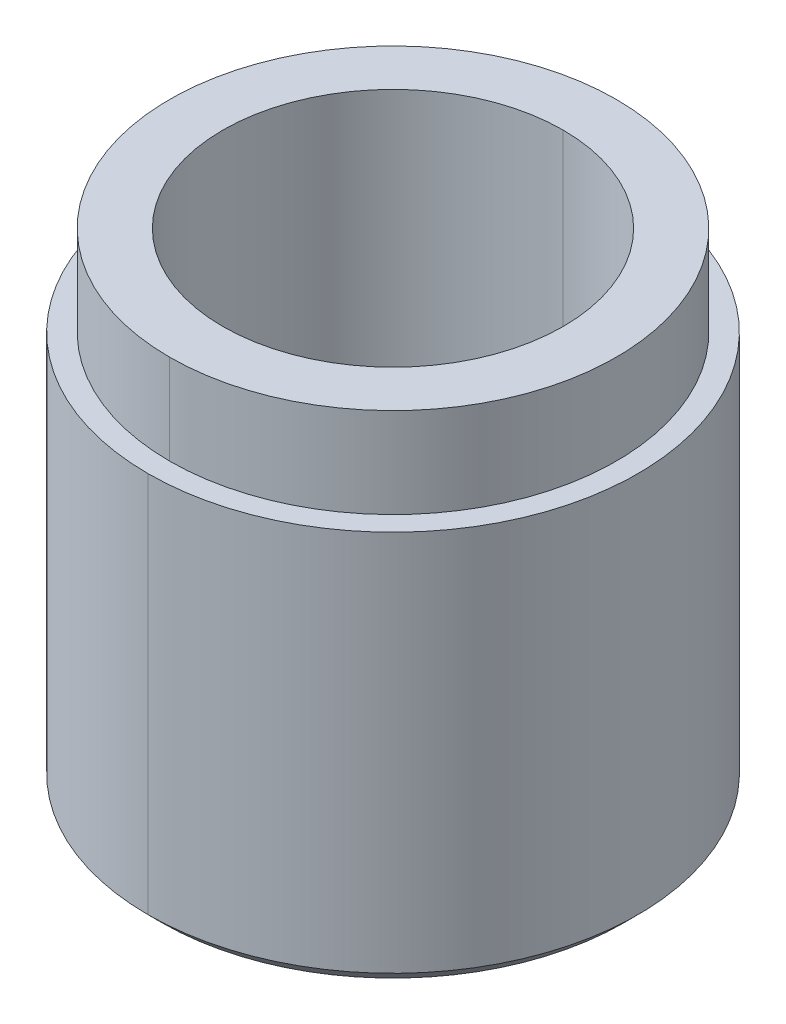
ISO-10303-21;
HEADER;
FILE_DESCRIPTION(('STEP AP214'),'2;1');
FILE_NAME('part.step','',(''),(''),'','','');
FILE_SCHEMA(('AUTOMOTIVE_DESIGN { 1 0 10303 214 1 1 1 1 }'));
ENDSEC;
DATA;
#1=APPLICATION_CONTEXT('core data for automotive mechanical design processes');
#2=APPLICATION_PROTOCOL_DEFINITION('international standard','automotive_design',2000,#1);
#3=PRODUCT_CONTEXT('',#1,'mechanical');
#4=PRODUCT('Part','Part','',(#3));
#5=PRODUCT_RELATED_PRODUCT_CATEGORY('part','',(#4));
#6=PRODUCT_DEFINITION_FORMATION('','',#4);
#7=PRODUCT_DEFINITION_CONTEXT('part definition',#1,'design');
#8=PRODUCT_DEFINITION('design','',#6,#7);
#9=PRODUCT_DEFINITION_SHAPE('','',#8);
#10=(LENGTH_UNIT() NAMED_UNIT(*) SI_UNIT(.MILLI.,.METRE.));
#11=(NAMED_UNIT(*) PLANE_ANGLE_UNIT() SI_UNIT($,.RADIAN.));
#12=(NAMED_UNIT(*) SI_UNIT($,.STERADIAN.) SOLID_ANGLE_UNIT());
#13=UNCERTAINTY_MEASURE_WITH_UNIT(LENGTH_MEASURE(1.E-05),#10,'distance_accuracy_value','');
#14=(GEOMETRIC_REPRESENTATION_CONTEXT(3) GLOBAL_UNCERTAINTY_ASSIGNED_CONTEXT((#13)) GLOBAL_UNIT_ASSIGNED_CONTEXT((#10,
#11,#12)) REPRESENTATION_CONTEXT('',''));
#15=CARTESIAN_POINT('',(0.,0.,0.));
#16=DIRECTION('',(0.,0.,1.));
#17=DIRECTION('',(1.,0.,0.));
#18=AXIS2_PLACEMENT_3D('',#15,#16,#17);
#19=CARTESIAN_POINT('',(0.,-8.0725,0.));
#20=DIRECTION('',(0.,1.,0.));
#21=DIRECTION('',(0.,0.,1.));
#22=AXIS2_PLACEMENT_3D('',#19,#20,#21);
#23=CONICAL_SURFACE('',#22,8.636,0.785398163397448);
#24=DIRECTION('',(0.,0.707106781186548,-0.707106781186548));
#25=VECTOR('',#24,1.);
#26=CARTESIAN_POINT('',(0.,-8.0725,-8.636));
#27=LINE('',#26,#25);
#28=CARTESIAN_POINT('',(0.,-8.5725,-8.136));
#29=VERTEX_POINT('',#28);
#30=CARTESIAN_POINT('',(0.,-8.0725,-8.636));
#31=VERTEX_POINT('',#30);
#32=EDGE_CURVE('E110',#29,#31,#27,.T.);
#33=ORIENTED_EDGE('',*,*,#32,.F.);
#34=CARTESIAN_POINT('',(0.,-8.5725,0.));
#35=DIRECTION('',(0.,-1.,0.));
#36=DIRECTION('',(0.,0.,1.));
#37=AXIS2_PLACEMENT_3D('',#34,#35,#36);
#38=CIRCLE('',#37,8.136);
#39=CARTESIAN_POINT('',(0.,-8.5725,8.136));
#40=VERTEX_POINT('',#39);
#41=EDGE_CURVE('E11',#40,#29,#38,.T.);
#42=ORIENTED_EDGE('',*,*,#41,.F.);
#43=DIRECTION('',(0.,0.707106781186548,0.707106781186548));
#44=VECTOR('',#43,1.);
#45=CARTESIAN_POINT('',(0.,-8.0725,8.636));
#46=LINE('',#45,#44);
#47=CARTESIAN_POINT('',(0.,-8.0725,8.636));
#48=VERTEX_POINT('',#47);
#49=EDGE_CURVE('E118',#40,#48,#46,.T.);
#50=ORIENTED_EDGE('',*,*,#49,.T.);
#51=CARTESIAN_POINT('',(0.,-8.0725,0.));
#52=DIRECTION('',(0.,1.,0.));
#53=DIRECTION('',(0.,0.,1.));
#54=AXIS2_PLACEMENT_3D('',#51,#52,#53);
#55=CIRCLE('',#54,8.636);
#56=EDGE_CURVE('E27',#31,#48,#55,.T.);
#57=ORIENTED_EDGE('',*,*,#56,.F.);
#58=EDGE_LOOP('',(#33,#42,#50,#57));
#59=FACE_BOUND('',#58,.T.);
#60=ADVANCED_FACE('F16',(#59),#23,.T.);
#61=CARTESIAN_POINT('',(0.,-8.5725,-8.636));
#62=DIRECTION('',(0.,1.,0.));
#63=DIRECTION('',(1.,0.,0.));
#64=AXIS2_PLACEMENT_3D('',#61,#62,#63);
#65=PLANE('',#64);
#66=CARTESIAN_POINT('',(0.,-8.5725,0.));
#67=DIRECTION('',(0.,1.,0.));
#68=DIRECTION('',(0.,0.,1.));
#69=AXIS2_PLACEMENT_3D('',#66,#67,#68);
#70=CIRCLE('',#69,6.);
#71=CARTESIAN_POINT('',(0.,-8.5725,6.));
#72=VERTEX_POINT('',#71);
#73=CARTESIAN_POINT('',(0.,-8.5725,-6.));
#74=VERTEX_POINT('',#73);
#75=EDGE_CURVE('E153',#72,#74,#70,.T.);
#76=ORIENTED_EDGE('',*,*,#75,.T.);
#77=CARTESIAN_POINT('',(0.,-8.5725,0.));
#78=DIRECTION('',(0.,1.,0.));
#79=DIRECTION('',(0.,0.,1.));
#80=AXIS2_PLACEMENT_3D('',#77,#78,#79);
#81=CIRCLE('',#80,6.);
#82=EDGE_CURVE('E159',#74,#72,#81,.T.);
#83=ORIENTED_EDGE('',*,*,#82,.T.);
#84=EDGE_LOOP('',(#76,#83));
#85=FACE_BOUND('',#84,.T.);
#86=ORIENTED_EDGE('',*,*,#41,.T.);
#87=CARTESIAN_POINT('',(0.,-8.5725,0.));
#88=DIRECTION('',(0.,-1.,0.));
#89=DIRECTION('',(0.,0.,1.));
#90=AXIS2_PLACEMENT_3D('',#87,#88,#89);
#91=CIRCLE('',#90,8.136);
#92=EDGE_CURVE('E105',#29,#40,#91,.T.);
#93=ORIENTED_EDGE('',*,*,#92,.T.);
#94=EDGE_LOOP('',(#86,#93));
#95=FACE_BOUND('',#94,.T.);
#96=ADVANCED_FACE('F103',(#85,#95),#65,.F.);
#97=CARTESIAN_POINT('',(0.,8.5725,0.));
#98=DIRECTION('',(0.,1.,0.));
#99=DIRECTION('',(0.,0.,1.));
#100=AXIS2_PLACEMENT_3D('',#97,#98,#99);
#101=CYLINDRICAL_SURFACE('',#100,8.636);
#102=DIRECTION('',(0.,1.,0.));
#103=VECTOR('',#102,1.);
#104=CARTESIAN_POINT('',(0.,8.5725,-8.636));
#105=LINE('',#104,#103);
#106=CARTESIAN_POINT('',(0.,5.3975,-8.636));
#107=VERTEX_POINT('',#106);
#108=EDGE_CURVE('E141',#31,#107,#105,.T.);
#109=ORIENTED_EDGE('',*,*,#108,.F.);
#110=ORIENTED_EDGE('',*,*,#56,.T.);
#111=DIRECTION('',(0.,1.,0.));
#112=VECTOR('',#111,1.);
#113=CARTESIAN_POINT('',(0.,8.5725,8.636));
#114=LINE('',#113,#112);
#115=CARTESIAN_POINT('',(0.,5.3975,8.636));
#116=VERTEX_POINT('',#115);
#117=EDGE_CURVE('E128',#48,#116,#114,.T.);
#118=ORIENTED_EDGE('',*,*,#117,.T.);
#119=CARTESIAN_POINT('',(0.,5.3975,0.));
#120=DIRECTION('',(0.,1.,0.));
#121=DIRECTION('',(0.,0.,1.));
#122=AXIS2_PLACEMENT_3D('',#119,#120,#121);
#123=CIRCLE('',#122,8.636);
#124=EDGE_CURVE('E137',#107,#116,#123,.T.);
#125=ORIENTED_EDGE('',*,*,#124,.F.);
#126=EDGE_LOOP('',(#109,#110,#118,#125));
#127=FACE_BOUND('',#126,.T.);
#128=ADVANCED_FACE('F180',(#127),#101,.T.);
#129=CARTESIAN_POINT('',(0.,5.3975,-7.874));
#130=DIRECTION('',(0.,-1.,0.));
#131=DIRECTION('',(0.,0.,-1.));
#132=AXIS2_PLACEMENT_3D('',#129,#130,#131);
#133=PLANE('',#132);
#134=CARTESIAN_POINT('',(0.,5.3975,0.));
#135=DIRECTION('',(0.,1.,0.));
#136=DIRECTION('',(0.,0.,1.));
#137=AXIS2_PLACEMENT_3D('',#134,#135,#136);
#138=CIRCLE('',#137,7.874);
#139=CARTESIAN_POINT('',(0.,5.3975,7.874));
#140=VERTEX_POINT('',#139);
#141=CARTESIAN_POINT('',(0.,5.3975,-7.874));
#142=VERTEX_POINT('',#141);
#143=EDGE_CURVE('E132',#140,#142,#138,.T.);
#144=ORIENTED_EDGE('',*,*,#143,.F.);
#145=CARTESIAN_POINT('',(0.,5.3975,0.));
#146=DIRECTION('',(0.,1.,0.));
#147=DIRECTION('',(0.,0.,1.));
#148=AXIS2_PLACEMENT_3D('',#145,#146,#147);
#149=CIRCLE('',#148,7.874);
#150=EDGE_CURVE('E135',#142,#140,#149,.T.);
#151=ORIENTED_EDGE('',*,*,#150,.F.);
#152=EDGE_LOOP('',(#144,#151));
#153=FACE_BOUND('',#152,.T.);
#154=CARTESIAN_POINT('',(0.,5.3975,0.));
#155=DIRECTION('',(0.,1.,0.));
#156=DIRECTION('',(0.,0.,1.));
#157=AXIS2_PLACEMENT_3D('',#154,#155,#156);
#158=CIRCLE('',#157,8.636);
#159=EDGE_CURVE('E20',#116,#107,#158,.T.);
#160=ORIENTED_EDGE('',*,*,#159,.T.);
#161=ORIENTED_EDGE('',*,*,#124,.T.);
#162=EDGE_LOOP('',(#160,#161));
#163=FACE_BOUND('',#162,.T.);
#164=ADVANCED_FACE('F18',(#153,#163),#133,.F.);
#165=CARTESIAN_POINT('',(0.,8.5725,0.));
#166=DIRECTION('',(0.,1.,0.));
#167=DIRECTION('',(0.,0.,1.));
#168=AXIS2_PLACEMENT_3D('',#165,#166,#167);
#169=CYLINDRICAL_SURFACE('',#168,7.874);
#170=DIRECTION('',(0.,1.,0.));
#171=VECTOR('',#170,1.);
#172=CARTESIAN_POINT('',(0.,8.5725,-7.874));
#173=LINE('',#172,#171);
#174=CARTESIAN_POINT('',(0.,8.5725,-7.874));
#175=VERTEX_POINT('',#174);
#176=EDGE_CURVE('E154',#142,#175,#173,.T.);
#177=ORIENTED_EDGE('',*,*,#176,.F.);
#178=ORIENTED_EDGE('',*,*,#150,.T.);
#179=DIRECTION('',(0.,1.,0.));
#180=VECTOR('',#179,1.);
#181=CARTESIAN_POINT('',(0.,8.5725,7.874));
#182=LINE('',#181,#180);
#183=CARTESIAN_POINT('',(0.,8.5725,7.874));
#184=VERTEX_POINT('',#183);
#185=EDGE_CURVE('E125',#140,#184,#182,.T.);
#186=ORIENTED_EDGE('',*,*,#185,.T.);
#187=CARTESIAN_POINT('',(0.,8.5725,0.));
#188=DIRECTION('',(0.,1.,0.));
#189=DIRECTION('',(0.,0.,1.));
#190=AXIS2_PLACEMENT_3D('',#187,#188,#189);
#191=CIRCLE('',#190,7.874);
#192=EDGE_CURVE('E64',#175,#184,#191,.T.);
#193=ORIENTED_EDGE('',*,*,#192,.F.);
#194=EDGE_LOOP('',(#177,#178,#186,#193));
#195=FACE_BOUND('',#194,.T.);
#196=ADVANCED_FACE('F316',(#195),#169,.T.);
#197=CARTESIAN_POINT('',(0.,8.5725,-6.));
#198=DIRECTION('',(0.,-1.,0.));
#199=DIRECTION('',(0.,0.,-1.));
#200=AXIS2_PLACEMENT_3D('',#197,#198,#199);
#201=PLANE('',#200);
#202=CARTESIAN_POINT('',(0.,8.5725,0.));
#203=DIRECTION('',(0.,1.,0.));
#204=DIRECTION('',(0.,0.,1.));
#205=AXIS2_PLACEMENT_3D('',#202,#203,#204);
#206=CIRCLE('',#205,6.);
#207=CARTESIAN_POINT('',(0.,8.5725,6.));
#208=VERTEX_POINT('',#207);
#209=CARTESIAN_POINT('',(0.,8.5725,-6.));
#210=VERTEX_POINT('',#209);
#211=EDGE_CURVE('E41',#208,#210,#206,.T.);
#212=ORIENTED_EDGE('',*,*,#211,.F.);
#213=CARTESIAN_POINT('',(0.,8.5725,0.));
#214=DIRECTION('',(0.,1.,0.));
#215=DIRECTION('',(0.,0.,1.));
#216=AXIS2_PLACEMENT_3D('',#213,#214,#215);
#217=CIRCLE('',#216,6.);
#218=EDGE_CURVE('E145',#210,#208,#217,.T.);
#219=ORIENTED_EDGE('',*,*,#218,.F.);
#220=EDGE_LOOP('',(#212,#219));
#221=FACE_BOUND('',#220,.T.);
#222=CARTESIAN_POINT('',(0.,8.5725,0.));
#223=DIRECTION('',(0.,1.,0.));
#224=DIRECTION('',(0.,0.,1.));
#225=AXIS2_PLACEMENT_3D('',#222,#223,#224);
#226=CIRCLE('',#225,7.874);
#227=EDGE_CURVE('E158',#184,#175,#226,.T.);
#228=ORIENTED_EDGE('',*,*,#227,.T.);
#229=ORIENTED_EDGE('',*,*,#192,.T.);
#230=EDGE_LOOP('',(#228,#229));
#231=FACE_BOUND('',#230,.T.);
#232=ADVANCED_FACE('F312',(#221,#231),#201,.F.);
#233=CARTESIAN_POINT('',(0.,8.5725,0.));
#234=DIRECTION('',(0.,1.,0.));
#235=DIRECTION('',(0.,0.,1.));
#236=AXIS2_PLACEMENT_3D('',#233,#234,#235);
#237=CYLINDRICAL_SURFACE('',#236,6.);
#238=DIRECTION('',(0.,1.,0.));
#239=VECTOR('',#238,1.);
#240=CARTESIAN_POINT('',(0.,8.5725,-6.));
#241=LINE('',#240,#239);
#242=EDGE_CURVE('E150',#74,#210,#241,.T.);
#243=ORIENTED_EDGE('',*,*,#242,.F.);
#244=ORIENTED_EDGE('',*,*,#75,.F.);
#245=DIRECTION('',(0.,1.,0.));
#246=VECTOR('',#245,1.);
#247=CARTESIAN_POINT('',(0.,8.5725,6.));
#248=LINE('',#247,#246);
#249=EDGE_CURVE('E149',#72,#208,#248,.T.);
#250=ORIENTED_EDGE('',*,*,#249,.T.);
#251=ORIENTED_EDGE('',*,*,#211,.T.);
#252=EDGE_LOOP('',(#243,#244,#250,#251));
#253=FACE_BOUND('',#252,.T.);
#254=ADVANCED_FACE('F292',(#253),#237,.F.);
#255=CARTESIAN_POINT('',(0.,8.5725,0.));
#256=DIRECTION('',(0.,1.,0.));
#257=DIRECTION('',(0.,0.,1.));
#258=AXIS2_PLACEMENT_3D('',#255,#256,#257);
#259=CYLINDRICAL_SURFACE('',#258,6.);
#260=ORIENTED_EDGE('',*,*,#82,.F.);
#261=ORIENTED_EDGE('',*,*,#242,.T.);
#262=ORIENTED_EDGE('',*,*,#218,.T.);
#263=ORIENTED_EDGE('',*,*,#249,.F.);
#264=EDGE_LOOP('',(#260,#261,#262,#263));
#265=FACE_BOUND('',#264,.T.);
#266=ADVANCED_FACE('F287',(#265),#259,.F.);
#267=CARTESIAN_POINT('',(0.,8.5725,0.));
#268=DIRECTION('',(0.,1.,0.));
#269=DIRECTION('',(0.,0.,1.));
#270=AXIS2_PLACEMENT_3D('',#267,#268,#269);
#271=CYLINDRICAL_SURFACE('',#270,7.874);
#272=ORIENTED_EDGE('',*,*,#143,.T.);
#273=ORIENTED_EDGE('',*,*,#176,.T.);
#274=ORIENTED_EDGE('',*,*,#227,.F.);
#275=ORIENTED_EDGE('',*,*,#185,.F.);
#276=EDGE_LOOP('',(#272,#273,#274,#275));
#277=FACE_BOUND('',#276,.T.);
#278=ADVANCED_FACE('F291',(#277),#271,.T.);
#279=CARTESIAN_POINT('',(0.,8.5725,0.));
#280=DIRECTION('',(0.,1.,0.));
#281=DIRECTION('',(0.,0.,1.));
#282=AXIS2_PLACEMENT_3D('',#279,#280,#281);
#283=CYLINDRICAL_SURFACE('',#282,8.636);
#284=CARTESIAN_POINT('',(0.,-8.0725,0.));
#285=DIRECTION('',(0.,1.,0.));
#286=DIRECTION('',(0.,0.,1.));
#287=AXIS2_PLACEMENT_3D('',#284,#285,#286);
#288=CIRCLE('',#287,8.636);
#289=EDGE_CURVE('E115',#48,#31,#288,.T.);
#290=ORIENTED_EDGE('',*,*,#289,.T.);
#291=ORIENTED_EDGE('',*,*,#108,.T.);
#292=ORIENTED_EDGE('',*,*,#159,.F.);
#293=ORIENTED_EDGE('',*,*,#117,.F.);
#294=EDGE_LOOP('',(#290,#291,#292,#293));
#295=FACE_BOUND('',#294,.T.);
#296=ADVANCED_FACE('F183',(#295),#283,.T.);
#297=CARTESIAN_POINT('',(0.,-8.0725,0.));
#298=DIRECTION('',(0.,1.,0.));
#299=DIRECTION('',(0.,0.,1.));
#300=AXIS2_PLACEMENT_3D('',#297,#298,#299);
#301=CONICAL_SURFACE('',#300,8.636,0.785398163397448);
#302=ORIENTED_EDGE('',*,*,#92,.F.);
#303=ORIENTED_EDGE('',*,*,#32,.T.);
#304=ORIENTED_EDGE('',*,*,#289,.F.);
#305=ORIENTED_EDGE('',*,*,#49,.F.);
#306=EDGE_LOOP('',(#302,#303,#304,#305));
#307=FACE_BOUND('',#306,.T.);
#308=ADVANCED_FACE('F117',(#307),#301,.T.);
#309=CLOSED_SHELL('',(#60,#96,#128,#164,#196,#232,#254,#266,#278,#296,#308));
#310=MANIFOLD_SOLID_BREP('B1',#309);
#311=ADVANCED_BREP_SHAPE_REPRESENTATION('',(#18,#310),#14);
#312=SHAPE_DEFINITION_REPRESENTATION(#9,#311);
ENDSEC;
END-ISO-10303-21;
